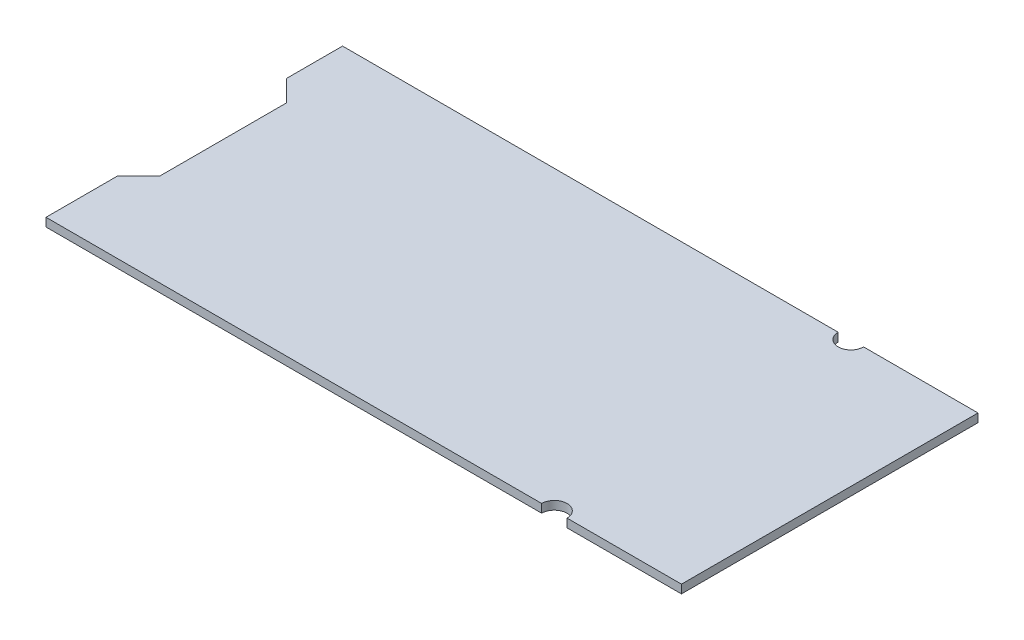
ISO-10303-21;
HEADER;
FILE_DESCRIPTION(('STEP AP214'),'2;1');
FILE_NAME('part.step','',(''),(''),'','','');
FILE_SCHEMA(('AUTOMOTIVE_DESIGN { 1 0 10303 214 1 1 1 1 }'));
ENDSEC;
DATA;
#1=APPLICATION_CONTEXT('core data for automotive mechanical design processes');
#2=APPLICATION_PROTOCOL_DEFINITION('international standard','automotive_design',2000,#1);
#3=PRODUCT_CONTEXT('',#1,'mechanical');
#4=PRODUCT('Part','Part','',(#3));
#5=PRODUCT_RELATED_PRODUCT_CATEGORY('part','',(#4));
#6=PRODUCT_DEFINITION_FORMATION('','',#4);
#7=PRODUCT_DEFINITION_CONTEXT('part definition',#1,'design');
#8=PRODUCT_DEFINITION('design','',#6,#7);
#9=PRODUCT_DEFINITION_SHAPE('','',#8);
#10=(LENGTH_UNIT() NAMED_UNIT(*) SI_UNIT(.MILLI.,.METRE.));
#11=(NAMED_UNIT(*) PLANE_ANGLE_UNIT() SI_UNIT($,.RADIAN.));
#12=(NAMED_UNIT(*) SI_UNIT($,.STERADIAN.) SOLID_ANGLE_UNIT());
#13=UNCERTAINTY_MEASURE_WITH_UNIT(LENGTH_MEASURE(1.E-05),#10,'distance_accuracy_value','');
#14=(GEOMETRIC_REPRESENTATION_CONTEXT(3) GLOBAL_UNCERTAINTY_ASSIGNED_CONTEXT((#13)) GLOBAL_UNIT_ASSIGNED_CONTEXT((#10,
#11,#12)) REPRESENTATION_CONTEXT('',''));
#15=CARTESIAN_POINT('',(0.,0.,0.));
#16=DIRECTION('',(0.,0.,1.));
#17=DIRECTION('',(1.,0.,0.));
#18=AXIS2_PLACEMENT_3D('',#15,#16,#17);
#19=CARTESIAN_POINT('',(-37.5,1.,-17.5));
#20=DIRECTION('',(0.,0.,1.));
#21=DIRECTION('',(1.,0.,0.));
#22=AXIS2_PLACEMENT_3D('',#19,#20,#21);
#23=PLANE('',#22);
#24=DIRECTION('',(-1.,0.,0.));
#25=VECTOR('',#24,1.);
#26=CARTESIAN_POINT('',(-37.5,0.,-17.5));
#27=LINE('',#26,#25);
#28=CARTESIAN_POINT('',(37.5,0.,-17.5));
#29=VERTEX_POINT('',#28);
#30=CARTESIAN_POINT('',(24.,0.,-17.5));
#31=VERTEX_POINT('',#30);
#32=EDGE_CURVE('E179',#29,#31,#27,.T.);
#33=ORIENTED_EDGE('',*,*,#32,.T.);
#34=DIRECTION('',(0.,1.,0.));
#35=VECTOR('',#34,1.);
#36=CARTESIAN_POINT('',(24.,-9.,-17.5));
#37=LINE('',#36,#35);
#38=CARTESIAN_POINT('',(24.,1.,-17.5));
#39=VERTEX_POINT('',#38);
#40=EDGE_CURVE('E252',#31,#39,#37,.T.);
#41=ORIENTED_EDGE('',*,*,#40,.T.);
#42=DIRECTION('',(-1.,0.,0.));
#43=VECTOR('',#42,1.);
#44=CARTESIAN_POINT('',(-37.5,1.,-17.5));
#45=LINE('',#44,#43);
#46=CARTESIAN_POINT('',(37.5,1.,-17.5));
#47=VERTEX_POINT('',#46);
#48=EDGE_CURVE('E267',#47,#39,#45,.T.);
#49=ORIENTED_EDGE('',*,*,#48,.F.);
#50=DIRECTION('',(0.,-1.,0.));
#51=VECTOR('',#50,1.);
#52=CARTESIAN_POINT('',(37.5,1.,-17.5));
#53=LINE('',#52,#51);
#54=EDGE_CURVE('E198',#47,#29,#53,.T.);
#55=ORIENTED_EDGE('',*,*,#54,.T.);
#56=EDGE_LOOP('',(#33,#41,#49,#55));
#57=FACE_BOUND('',#56,.T.);
#58=ADVANCED_FACE('F40',(#57),#23,.F.);
#59=CARTESIAN_POINT('',(-37.5,1.,-17.5));
#60=DIRECTION('',(1.,0.,0.));
#61=DIRECTION('',(0.,0.,-1.));
#62=AXIS2_PLACEMENT_3D('',#59,#60,#61);
#63=PLANE('',#62);
#64=DIRECTION('',(0.,0.,1.));
#65=VECTOR('',#64,1.);
#66=CARTESIAN_POINT('',(-37.5,1.,-17.5));
#67=LINE('',#66,#65);
#68=CARTESIAN_POINT('',(-37.5,1.,9.11));
#69=VERTEX_POINT('',#68);
#70=CARTESIAN_POINT('',(-37.5,1.,17.5));
#71=VERTEX_POINT('',#70);
#72=EDGE_CURVE('E158',#69,#71,#67,.T.);
#73=ORIENTED_EDGE('',*,*,#72,.F.);
#74=DIRECTION('',(0.,-1.,0.));
#75=VECTOR('',#74,1.);
#76=CARTESIAN_POINT('',(-37.5,1.,9.11));
#77=LINE('',#76,#75);
#78=CARTESIAN_POINT('',(-37.5,0.,9.11));
#79=VERTEX_POINT('',#78);
#80=EDGE_CURVE('E178',#69,#79,#77,.T.);
#81=ORIENTED_EDGE('',*,*,#80,.T.);
#82=DIRECTION('',(0.,0.,1.));
#83=VECTOR('',#82,1.);
#84=CARTESIAN_POINT('',(-37.5,0.,-17.5));
#85=LINE('',#84,#83);
#86=CARTESIAN_POINT('',(-37.5,0.,17.5));
#87=VERTEX_POINT('',#86);
#88=EDGE_CURVE('E183',#79,#87,#85,.T.);
#89=ORIENTED_EDGE('',*,*,#88,.T.);
#90=DIRECTION('',(0.,-1.,0.));
#91=VECTOR('',#90,1.);
#92=CARTESIAN_POINT('',(-37.5,1.,17.5));
#93=LINE('',#92,#91);
#94=EDGE_CURVE('E167',#71,#87,#93,.T.);
#95=ORIENTED_EDGE('',*,*,#94,.F.);
#96=EDGE_LOOP('',(#73,#81,#89,#95));
#97=FACE_BOUND('',#96,.T.);
#98=ADVANCED_FACE('F274',(#97),#63,.F.);
#99=CARTESIAN_POINT('',(-37.5,1.,17.5));
#100=DIRECTION('',(0.,0.,-1.));
#101=DIRECTION('',(-1.,0.,0.));
#102=AXIS2_PLACEMENT_3D('',#99,#100,#101);
#103=PLANE('',#102);
#104=DIRECTION('',(1.,0.,0.));
#105=VECTOR('',#104,1.);
#106=CARTESIAN_POINT('',(-37.5,0.,17.5));
#107=LINE('',#106,#105);
#108=CARTESIAN_POINT('',(21.,0.,17.5));
#109=VERTEX_POINT('',#108);
#110=EDGE_CURVE('E151',#87,#109,#107,.T.);
#111=ORIENTED_EDGE('',*,*,#110,.T.);
#112=DIRECTION('',(0.,1.,0.));
#113=VECTOR('',#112,1.);
#114=CARTESIAN_POINT('',(21.,-9.,17.5));
#115=LINE('',#114,#113);
#116=CARTESIAN_POINT('',(21.,1.,17.5));
#117=VERTEX_POINT('',#116);
#118=EDGE_CURVE('E134',#109,#117,#115,.T.);
#119=ORIENTED_EDGE('',*,*,#118,.T.);
#120=DIRECTION('',(1.,0.,0.));
#121=VECTOR('',#120,1.);
#122=CARTESIAN_POINT('',(-37.5,1.,17.5));
#123=LINE('',#122,#121);
#124=EDGE_CURVE('E149',#71,#117,#123,.T.);
#125=ORIENTED_EDGE('',*,*,#124,.F.);
#126=ORIENTED_EDGE('',*,*,#94,.T.);
#127=EDGE_LOOP('',(#111,#119,#125,#126));
#128=FACE_BOUND('',#127,.T.);
#129=ADVANCED_FACE('F147',(#128),#103,.F.);
#130=CARTESIAN_POINT('',(37.5,1.,-17.5));
#131=DIRECTION('',(-1.,0.,0.));
#132=DIRECTION('',(0.,0.,1.));
#133=AXIS2_PLACEMENT_3D('',#130,#131,#132);
#134=PLANE('',#133);
#135=DIRECTION('',(0.,0.,-1.));
#136=VECTOR('',#135,1.);
#137=CARTESIAN_POINT('',(37.5,0.,-17.5));
#138=LINE('',#137,#136);
#139=CARTESIAN_POINT('',(37.5,0.,17.5));
#140=VERTEX_POINT('',#139);
#141=EDGE_CURVE('E173',#140,#29,#138,.T.);
#142=ORIENTED_EDGE('',*,*,#141,.T.);
#143=ORIENTED_EDGE('',*,*,#54,.F.);
#144=DIRECTION('',(0.,0.,-1.));
#145=VECTOR('',#144,1.);
#146=CARTESIAN_POINT('',(37.5,1.,-17.5));
#147=LINE('',#146,#145);
#148=CARTESIAN_POINT('',(37.5,1.,17.5));
#149=VERTEX_POINT('',#148);
#150=EDGE_CURVE('E190',#149,#47,#147,.T.);
#151=ORIENTED_EDGE('',*,*,#150,.F.);
#152=DIRECTION('',(0.,-1.,0.));
#153=VECTOR('',#152,1.);
#154=CARTESIAN_POINT('',(37.5,1.,17.5));
#155=LINE('',#154,#153);
#156=EDGE_CURVE('E161',#149,#140,#155,.T.);
#157=ORIENTED_EDGE('',*,*,#156,.T.);
#158=EDGE_LOOP('',(#142,#143,#151,#157));
#159=FACE_BOUND('',#158,.T.);
#160=ADVANCED_FACE('F284',(#159),#134,.F.);
#161=CARTESIAN_POINT('',(21.,1.,-17.5));
#162=VERTEX_POINT('',#161);
#163=CARTESIAN_POINT('',(-37.5,1.,-17.5));
#164=VERTEX_POINT('',#163);
#165=EDGE_CURVE('E245',#162,#164,#45,.T.);
#166=ORIENTED_EDGE('',*,*,#165,.F.);
#167=DIRECTION('',(0.,1.,0.));
#168=VECTOR('',#167,1.);
#169=CARTESIAN_POINT('',(21.,-9.,-17.5));
#170=LINE('',#169,#168);
#171=CARTESIAN_POINT('',(21.,0.,-17.5));
#172=VERTEX_POINT('',#171);
#173=EDGE_CURVE('E153',#162,#172,#170,.F.);
#174=ORIENTED_EDGE('',*,*,#173,.T.);
#175=CARTESIAN_POINT('',(-37.5,0.,-17.5));
#176=VERTEX_POINT('',#175);
#177=EDGE_CURVE('E177',#172,#176,#27,.T.);
#178=ORIENTED_EDGE('',*,*,#177,.T.);
#179=DIRECTION('',(0.,-1.,0.));
#180=VECTOR('',#179,1.);
#181=CARTESIAN_POINT('',(-37.5,1.,-17.5));
#182=LINE('',#181,#180);
#183=EDGE_CURVE('E194',#164,#176,#182,.T.);
#184=ORIENTED_EDGE('',*,*,#183,.F.);
#185=EDGE_LOOP('',(#166,#174,#178,#184));
#186=FACE_BOUND('',#185,.T.);
#187=ADVANCED_FACE('F243',(#186),#23,.F.);
#188=CARTESIAN_POINT('',(-37.5,0.,-10.89));
#189=VERTEX_POINT('',#188);
#190=EDGE_CURVE('E184',#176,#189,#85,.T.);
#191=ORIENTED_EDGE('',*,*,#190,.T.);
#192=DIRECTION('',(0.,1.,0.));
#193=VECTOR('',#192,1.);
#194=CARTESIAN_POINT('',(-37.5,1.,-10.89));
#195=LINE('',#194,#193);
#196=CARTESIAN_POINT('',(-37.5,1.,-10.89));
#197=VERTEX_POINT('',#196);
#198=EDGE_CURVE('E234',#189,#197,#195,.T.);
#199=ORIENTED_EDGE('',*,*,#198,.T.);
#200=EDGE_CURVE('E169',#164,#197,#67,.T.);
#201=ORIENTED_EDGE('',*,*,#200,.F.);
#202=ORIENTED_EDGE('',*,*,#183,.T.);
#203=EDGE_LOOP('',(#191,#199,#201,#202));
#204=FACE_BOUND('',#203,.T.);
#205=ADVANCED_FACE('F239',(#204),#63,.F.);
#206=CARTESIAN_POINT('',(24.,1.,17.5));
#207=VERTEX_POINT('',#206);
#208=EDGE_CURVE('E162',#207,#149,#123,.T.);
#209=ORIENTED_EDGE('',*,*,#208,.F.);
#210=DIRECTION('',(0.,1.,0.));
#211=VECTOR('',#210,1.);
#212=CARTESIAN_POINT('',(24.,-9.,17.5));
#213=LINE('',#212,#211);
#214=CARTESIAN_POINT('',(24.,0.,17.5));
#215=VERTEX_POINT('',#214);
#216=EDGE_CURVE('E137',#207,#215,#213,.F.);
#217=ORIENTED_EDGE('',*,*,#216,.T.);
#218=EDGE_CURVE('E188',#215,#140,#107,.T.);
#219=ORIENTED_EDGE('',*,*,#218,.T.);
#220=ORIENTED_EDGE('',*,*,#156,.F.);
#221=EDGE_LOOP('',(#209,#217,#219,#220));
#222=FACE_BOUND('',#221,.T.);
#223=ADVANCED_FACE('F279',(#222),#103,.F.);
#224=CARTESIAN_POINT('',(0.,1.,0.));
#225=DIRECTION('',(0.,1.,0.));
#226=DIRECTION('',(0.,0.,1.));
#227=AXIS2_PLACEMENT_3D('',#224,#225,#226);
#228=PLANE('',#227);
#229=DIRECTION('',(0.,0.,-1.));
#230=VECTOR('',#229,1.);
#231=CARTESIAN_POINT('',(-35.,1.,-10.89));
#232=LINE('',#231,#230);
#233=CARTESIAN_POINT('',(-35.,1.,6.60999999999997));
#234=VERTEX_POINT('',#233);
#235=CARTESIAN_POINT('',(-35.,1.,-8.39000000000001));
#236=VERTEX_POINT('',#235);
#237=EDGE_CURVE('E224',#234,#236,#232,.T.);
#238=ORIENTED_EDGE('',*,*,#237,.F.);
#239=DIRECTION('',(0.707106781186543,0.,-0.707106781186552));
#240=VECTOR('',#239,1.);
#241=CARTESIAN_POINT('',(-35.,1.,6.60999999999997));
#242=LINE('',#241,#240);
#243=EDGE_CURVE('E218',#234,#69,#242,.F.);
#244=ORIENTED_EDGE('',*,*,#243,.T.);
#245=ORIENTED_EDGE('',*,*,#72,.T.);
#246=ORIENTED_EDGE('',*,*,#124,.T.);
#247=CARTESIAN_POINT('',(22.5,1.,17.5));
#248=DIRECTION('',(0.,1.,0.));
#249=DIRECTION('',(0.,0.,-1.));
#250=AXIS2_PLACEMENT_3D('',#247,#248,#249);
#251=CIRCLE('',#250,1.5);
#252=EDGE_CURVE('E131',#207,#117,#251,.T.);
#253=ORIENTED_EDGE('',*,*,#252,.F.);
#254=ORIENTED_EDGE('',*,*,#208,.T.);
#255=ORIENTED_EDGE('',*,*,#150,.T.);
#256=ORIENTED_EDGE('',*,*,#48,.T.);
#257=CARTESIAN_POINT('',(22.5,1.,-17.5));
#258=DIRECTION('',(0.,1.,0.));
#259=DIRECTION('',(0.,0.,1.));
#260=AXIS2_PLACEMENT_3D('',#257,#258,#259);
#261=CIRCLE('',#260,1.5);
#262=EDGE_CURVE('E142',#162,#39,#261,.T.);
#263=ORIENTED_EDGE('',*,*,#262,.F.);
#264=ORIENTED_EDGE('',*,*,#165,.T.);
#265=ORIENTED_EDGE('',*,*,#200,.T.);
#266=DIRECTION('',(-0.707106781186551,0.,-0.707106781186544));
#267=VECTOR('',#266,1.);
#268=CARTESIAN_POINT('',(-37.5,1.,-10.89));
#269=LINE('',#268,#267);
#270=EDGE_CURVE('E50',#197,#236,#269,.F.);
#271=ORIENTED_EDGE('',*,*,#270,.T.);
#272=EDGE_LOOP('',(#238,#244,#245,#246,#253,#254,#255,#256,#263,#264,#265,#271));
#273=FACE_BOUND('',#272,.T.);
#274=ADVANCED_FACE('F156',(#273),#228,.T.);
#275=CARTESIAN_POINT('',(0.,0.,0.));
#276=DIRECTION('',(0.,1.,0.));
#277=DIRECTION('',(0.,0.,1.));
#278=AXIS2_PLACEMENT_3D('',#275,#276,#277);
#279=PLANE('',#278);
#280=ORIENTED_EDGE('',*,*,#88,.F.);
#281=DIRECTION('',(-0.707106781186543,0.,0.707106781186552));
#282=VECTOR('',#281,1.);
#283=CARTESIAN_POINT('',(-14.1950000000003,0.,-14.1950000000001));
#284=LINE('',#283,#282);
#285=CARTESIAN_POINT('',(-35.,0.,6.60999999999997));
#286=VERTEX_POINT('',#285);
#287=EDGE_CURVE('E64',#79,#286,#284,.F.);
#288=ORIENTED_EDGE('',*,*,#287,.T.);
#289=DIRECTION('',(0.,0.,-1.));
#290=VECTOR('',#289,1.);
#291=CARTESIAN_POINT('',(-35.,0.,0.));
#292=LINE('',#291,#290);
#293=CARTESIAN_POINT('',(-35.,0.,-8.39000000000001));
#294=VERTEX_POINT('',#293);
#295=EDGE_CURVE('E209',#286,#294,#292,.T.);
#296=ORIENTED_EDGE('',*,*,#295,.T.);
#297=DIRECTION('',(0.707106781186551,0.,0.707106781186544));
#298=VECTOR('',#297,1.);
#299=CARTESIAN_POINT('',(-13.3049999999998,0.,13.3049999999999));
#300=LINE('',#299,#298);
#301=EDGE_CURVE('E11',#294,#189,#300,.F.);
#302=ORIENTED_EDGE('',*,*,#301,.T.);
#303=ORIENTED_EDGE('',*,*,#190,.F.);
#304=ORIENTED_EDGE('',*,*,#177,.F.);
#305=CARTESIAN_POINT('',(22.5,0.,-17.5));
#306=DIRECTION('',(0.,1.,0.));
#307=DIRECTION('',(0.,0.,1.));
#308=AXIS2_PLACEMENT_3D('',#305,#306,#307);
#309=CIRCLE('',#308,1.5);
#310=EDGE_CURVE('E205',#172,#31,#309,.T.);
#311=ORIENTED_EDGE('',*,*,#310,.T.);
#312=ORIENTED_EDGE('',*,*,#32,.F.);
#313=ORIENTED_EDGE('',*,*,#141,.F.);
#314=ORIENTED_EDGE('',*,*,#218,.F.);
#315=CARTESIAN_POINT('',(22.5,0.,17.5));
#316=DIRECTION('',(0.,1.,0.));
#317=DIRECTION('',(0.,0.,1.));
#318=AXIS2_PLACEMENT_3D('',#315,#316,#317);
#319=CIRCLE('',#318,1.5);
#320=EDGE_CURVE('E202',#215,#109,#319,.T.);
#321=ORIENTED_EDGE('',*,*,#320,.T.);
#322=ORIENTED_EDGE('',*,*,#110,.F.);
#323=EDGE_LOOP('',(#280,#288,#296,#302,#303,#304,#311,#312,#313,#314,#321,#322));
#324=FACE_BOUND('',#323,.T.);
#325=ADVANCED_FACE('F236',(#324),#279,.F.);
#326=CARTESIAN_POINT('',(22.5,-9.,17.5));
#327=DIRECTION('',(0.,1.,0.));
#328=DIRECTION('',(0.,0.,1.));
#329=AXIS2_PLACEMENT_3D('',#326,#327,#328);
#330=CYLINDRICAL_SURFACE('',#329,1.5);
#331=ORIENTED_EDGE('',*,*,#320,.F.);
#332=ORIENTED_EDGE('',*,*,#216,.F.);
#333=ORIENTED_EDGE('',*,*,#252,.T.);
#334=ORIENTED_EDGE('',*,*,#118,.F.);
#335=EDGE_LOOP('',(#331,#332,#333,#334));
#336=FACE_BOUND('',#335,.T.);
#337=ADVANCED_FACE('F133',(#336),#330,.F.);
#338=CARTESIAN_POINT('',(22.5,-9.,-17.5));
#339=DIRECTION('',(0.,1.,0.));
#340=DIRECTION('',(0.,0.,1.));
#341=AXIS2_PLACEMENT_3D('',#338,#339,#340);
#342=CYLINDRICAL_SURFACE('',#341,1.5);
#343=ORIENTED_EDGE('',*,*,#310,.F.);
#344=ORIENTED_EDGE('',*,*,#173,.F.);
#345=ORIENTED_EDGE('',*,*,#262,.T.);
#346=ORIENTED_EDGE('',*,*,#40,.F.);
#347=EDGE_LOOP('',(#343,#344,#345,#346));
#348=FACE_BOUND('',#347,.T.);
#349=ADVANCED_FACE('F286',(#348),#342,.F.);
#350=CARTESIAN_POINT('',(-35.,-9.,-10.89));
#351=DIRECTION('',(1.,0.,0.));
#352=DIRECTION('',(0.,0.,-1.));
#353=AXIS2_PLACEMENT_3D('',#350,#351,#352);
#354=PLANE('',#353);
#355=ORIENTED_EDGE('',*,*,#295,.F.);
#356=DIRECTION('',(0.,1.,0.));
#357=VECTOR('',#356,1.);
#358=CARTESIAN_POINT('',(-35.,1.,6.60999999999997));
#359=LINE('',#358,#357);
#360=EDGE_CURVE('E214',#286,#234,#359,.T.);
#361=ORIENTED_EDGE('',*,*,#360,.T.);
#362=ORIENTED_EDGE('',*,*,#237,.T.);
#363=DIRECTION('',(0.,-1.,0.));
#364=VECTOR('',#363,1.);
#365=CARTESIAN_POINT('',(-35.,0.,-8.39000000000001));
#366=LINE('',#365,#364);
#367=EDGE_CURVE('E57',#236,#294,#366,.T.);
#368=ORIENTED_EDGE('',*,*,#367,.T.);
#369=EDGE_LOOP('',(#355,#361,#362,#368));
#370=FACE_BOUND('',#369,.T.);
#371=ADVANCED_FACE('F229',(#370),#354,.F.);
#372=CARTESIAN_POINT('',(-35.,-9.,6.60999999999997));
#373=DIRECTION('',(-0.707106781186552,0.,-0.707106781186542));
#374=DIRECTION('',(0.,-1.,0.));
#375=AXIS2_PLACEMENT_3D('',#372,#373,#374);
#376=PLANE('',#375);
#377=ORIENTED_EDGE('',*,*,#287,.F.);
#378=ORIENTED_EDGE('',*,*,#80,.F.);
#379=ORIENTED_EDGE('',*,*,#243,.F.);
#380=ORIENTED_EDGE('',*,*,#360,.F.);
#381=EDGE_LOOP('',(#377,#378,#379,#380));
#382=FACE_BOUND('',#381,.T.);
#383=ADVANCED_FACE('F293',(#382),#376,.T.);
#384=CARTESIAN_POINT('',(-37.5,-9.,-10.89));
#385=DIRECTION('',(-0.707106781186544,0.,0.707106781186551));
#386=DIRECTION('',(0.,-1.,0.));
#387=AXIS2_PLACEMENT_3D('',#384,#385,#386);
#388=PLANE('',#387);
#389=ORIENTED_EDGE('',*,*,#301,.F.);
#390=ORIENTED_EDGE('',*,*,#367,.F.);
#391=ORIENTED_EDGE('',*,*,#270,.F.);
#392=ORIENTED_EDGE('',*,*,#198,.F.);
#393=EDGE_LOOP('',(#389,#390,#391,#392));
#394=FACE_BOUND('',#393,.T.);
#395=ADVANCED_FACE('F43',(#394),#388,.T.);
#396=CLOSED_SHELL('',(#58,#98,#129,#160,#187,#205,#223,#274,#325,#337,#349,#371,#383,#395));
#397=MANIFOLD_SOLID_BREP('B2',#396);
#398=ADVANCED_BREP_SHAPE_REPRESENTATION('',(#18,#397),#14);
#399=SHAPE_DEFINITION_REPRESENTATION(#9,#398);
ENDSEC;
END-ISO-10303-21;
